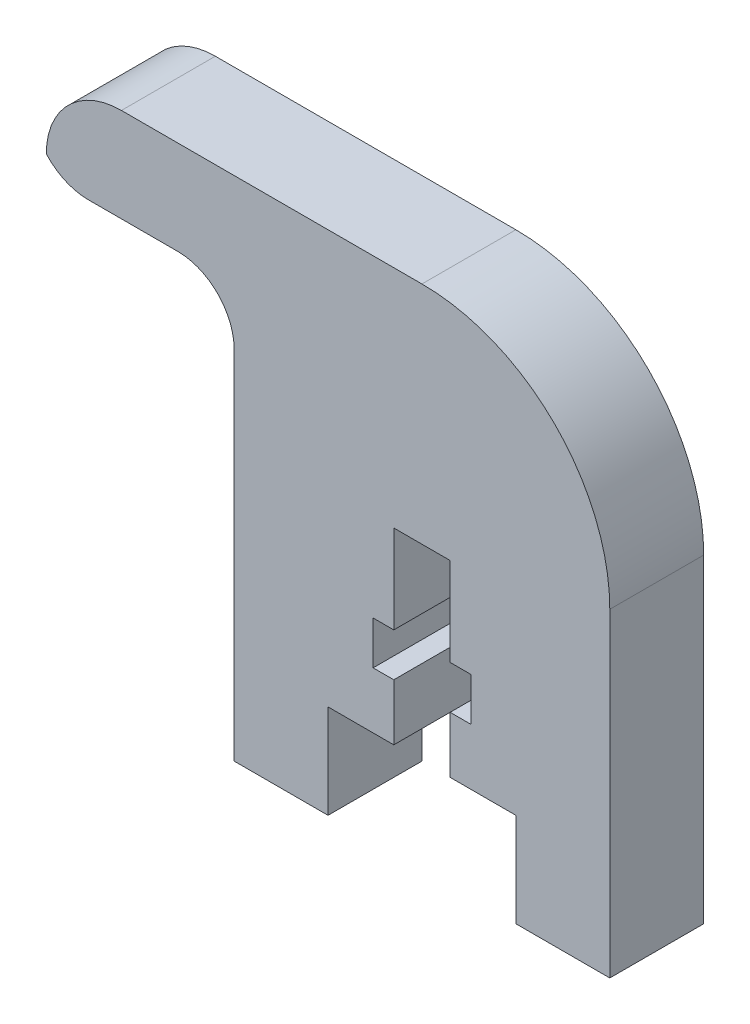
ISO-10303-21;
HEADER;
FILE_DESCRIPTION(('STEP AP214'),'2;1');
FILE_NAME('part.step','',(''),(''),'','','');
FILE_SCHEMA(('AUTOMOTIVE_DESIGN { 1 0 10303 214 1 1 1 1 }'));
ENDSEC;
DATA;
#1=APPLICATION_CONTEXT('core data for automotive mechanical design processes');
#2=APPLICATION_PROTOCOL_DEFINITION('international standard','automotive_design',2000,#1);
#3=PRODUCT_CONTEXT('',#1,'mechanical');
#4=PRODUCT('Part','Part','',(#3));
#5=PRODUCT_RELATED_PRODUCT_CATEGORY('part','',(#4));
#6=PRODUCT_DEFINITION_FORMATION('','',#4);
#7=PRODUCT_DEFINITION_CONTEXT('part definition',#1,'design');
#8=PRODUCT_DEFINITION('design','',#6,#7);
#9=PRODUCT_DEFINITION_SHAPE('','',#8);
#10=(LENGTH_UNIT() NAMED_UNIT(*) SI_UNIT(.MILLI.,.METRE.));
#11=(NAMED_UNIT(*) PLANE_ANGLE_UNIT() SI_UNIT($,.RADIAN.));
#12=(NAMED_UNIT(*) SI_UNIT($,.STERADIAN.) SOLID_ANGLE_UNIT());
#13=UNCERTAINTY_MEASURE_WITH_UNIT(LENGTH_MEASURE(1.E-05),#10,'distance_accuracy_value','');
#14=(GEOMETRIC_REPRESENTATION_CONTEXT(3) GLOBAL_UNCERTAINTY_ASSIGNED_CONTEXT((#13)) GLOBAL_UNIT_ASSIGNED_CONTEXT((#10,
#11,#12)) REPRESENTATION_CONTEXT('',''));
#15=CARTESIAN_POINT('',(0.,0.,0.));
#16=DIRECTION('',(0.,0.,1.));
#17=DIRECTION('',(1.,0.,0.));
#18=AXIS2_PLACEMENT_3D('',#15,#16,#17);
#19=CARTESIAN_POINT('',(-24.9425171950352,8.,5.));
#20=DIRECTION('',(-1.,0.,0.));
#21=DIRECTION('',(0.,0.,1.));
#22=AXIS2_PLACEMENT_3D('',#19,#20,#21);
#23=PLANE('',#22);
#24=DIRECTION('',(0.,1.,0.));
#25=VECTOR('',#24,1.);
#26=CARTESIAN_POINT('',(-24.9425171950352,8.,0.));
#27=LINE('',#26,#25);
#28=CARTESIAN_POINT('',(-24.9425171950352,5.,0.));
#29=VERTEX_POINT('',#28);
#30=CARTESIAN_POINT('',(-24.9425171950352,8.,0.));
#31=VERTEX_POINT('',#30);
#32=EDGE_CURVE('E222',#29,#31,#27,.T.);
#33=ORIENTED_EDGE('',*,*,#32,.T.);
#34=DIRECTION('',(0.,0.,-1.));
#35=VECTOR('',#34,1.);
#36=CARTESIAN_POINT('',(-24.9425171950352,8.,5.));
#37=LINE('',#36,#35);
#38=CARTESIAN_POINT('',(-24.9425171950352,8.,5.));
#39=VERTEX_POINT('',#38);
#40=EDGE_CURVE('E204',#39,#31,#37,.T.);
#41=ORIENTED_EDGE('',*,*,#40,.F.);
#42=DIRECTION('',(0.,1.,0.));
#43=VECTOR('',#42,1.);
#44=CARTESIAN_POINT('',(-24.9425171950352,8.,5.));
#45=LINE('',#44,#43);
#46=CARTESIAN_POINT('',(-24.9425171950352,5.,5.));
#47=VERTEX_POINT('',#46);
#48=EDGE_CURVE('E210',#47,#39,#45,.T.);
#49=ORIENTED_EDGE('',*,*,#48,.F.);
#50=DIRECTION('',(0.,0.,-1.));
#51=VECTOR('',#50,1.);
#52=CARTESIAN_POINT('',(-24.9425171950352,5.,5.));
#53=LINE('',#52,#51);
#54=EDGE_CURVE('E289',#47,#29,#53,.T.);
#55=ORIENTED_EDGE('',*,*,#54,.T.);
#56=EDGE_LOOP('',(#33,#41,#49,#55));
#57=FACE_BOUND('',#56,.T.);
#58=ADVANCED_FACE('F33',(#57),#23,.F.);
#59=CARTESIAN_POINT('',(-24.9425171950352,8.,5.));
#60=DIRECTION('',(0.,-1.,0.));
#61=DIRECTION('',(1.,0.,0.));
#62=AXIS2_PLACEMENT_3D('',#59,#60,#61);
#63=PLANE('',#62);
#64=DIRECTION('',(-1.,0.,0.));
#65=VECTOR('',#64,1.);
#66=CARTESIAN_POINT('',(-24.9425171950352,8.,0.));
#67=LINE('',#66,#65);
#68=CARTESIAN_POINT('',(-26.0425171950352,8.00000000000001,0.));
#69=VERTEX_POINT('',#68);
#70=EDGE_CURVE('E291',#31,#69,#67,.T.);
#71=ORIENTED_EDGE('',*,*,#70,.T.);
#72=DIRECTION('',(0.,0.,-1.));
#73=VECTOR('',#72,1.);
#74=CARTESIAN_POINT('',(-26.0425171950352,8.00000000000001,5.));
#75=LINE('',#74,#73);
#76=CARTESIAN_POINT('',(-26.0425171950352,8.00000000000001,5.));
#77=VERTEX_POINT('',#76);
#78=EDGE_CURVE('E207',#77,#69,#75,.T.);
#79=ORIENTED_EDGE('',*,*,#78,.F.);
#80=DIRECTION('',(-1.,0.,0.));
#81=VECTOR('',#80,1.);
#82=CARTESIAN_POINT('',(-24.9425171950352,8.,5.));
#83=LINE('',#82,#81);
#84=EDGE_CURVE('E200',#39,#77,#83,.T.);
#85=ORIENTED_EDGE('',*,*,#84,.F.);
#86=ORIENTED_EDGE('',*,*,#40,.T.);
#87=EDGE_LOOP('',(#71,#79,#85,#86));
#88=FACE_BOUND('',#87,.T.);
#89=ADVANCED_FACE('F202',(#88),#63,.F.);
#90=CARTESIAN_POINT('',(-26.0425171950352,8.00000000000001,5.));
#91=DIRECTION('',(-1.,0.,0.));
#92=DIRECTION('',(0.,0.,1.));
#93=AXIS2_PLACEMENT_3D('',#90,#91,#92);
#94=PLANE('',#93);
#95=DIRECTION('',(0.,1.,0.));
#96=VECTOR('',#95,1.);
#97=CARTESIAN_POINT('',(-26.0425171950352,8.00000000000001,0.));
#98=LINE('',#97,#96);
#99=CARTESIAN_POINT('',(-26.0425171950352,10.3,0.));
#100=VERTEX_POINT('',#99);
#101=EDGE_CURVE('E293',#69,#100,#98,.T.);
#102=ORIENTED_EDGE('',*,*,#101,.T.);
#103=DIRECTION('',(0.,0.,-1.));
#104=VECTOR('',#103,1.);
#105=CARTESIAN_POINT('',(-26.0425171950352,10.3,5.));
#106=LINE('',#105,#104);
#107=CARTESIAN_POINT('',(-26.0425171950352,10.3,5.));
#108=VERTEX_POINT('',#107);
#109=EDGE_CURVE('E228',#108,#100,#106,.T.);
#110=ORIENTED_EDGE('',*,*,#109,.F.);
#111=DIRECTION('',(0.,1.,0.));
#112=VECTOR('',#111,1.);
#113=CARTESIAN_POINT('',(-26.0425171950352,8.00000000000001,5.));
#114=LINE('',#113,#112);
#115=EDGE_CURVE('E209',#77,#108,#114,.T.);
#116=ORIENTED_EDGE('',*,*,#115,.F.);
#117=ORIENTED_EDGE('',*,*,#78,.T.);
#118=EDGE_LOOP('',(#102,#110,#116,#117));
#119=FACE_BOUND('',#118,.T.);
#120=ADVANCED_FACE('F486',(#119),#94,.F.);
#121=CARTESIAN_POINT('',(-26.0425171950352,10.3,5.));
#122=DIRECTION('',(0.,1.,0.));
#123=DIRECTION('',(-1.,0.,0.));
#124=AXIS2_PLACEMENT_3D('',#121,#122,#123);
#125=PLANE('',#124);
#126=DIRECTION('',(1.,0.,0.));
#127=VECTOR('',#126,1.);
#128=CARTESIAN_POINT('',(-26.0425171950352,10.3,0.));
#129=LINE('',#128,#127);
#130=CARTESIAN_POINT('',(-24.9425171950352,10.3,0.));
#131=VERTEX_POINT('',#130);
#132=EDGE_CURVE('E295',#100,#131,#129,.T.);
#133=ORIENTED_EDGE('',*,*,#132,.T.);
#134=DIRECTION('',(0.,0.,-1.));
#135=VECTOR('',#134,1.);
#136=CARTESIAN_POINT('',(-24.9425171950352,10.3,5.));
#137=LINE('',#136,#135);
#138=CARTESIAN_POINT('',(-24.9425171950352,10.3,5.));
#139=VERTEX_POINT('',#138);
#140=EDGE_CURVE('E367',#139,#131,#137,.T.);
#141=ORIENTED_EDGE('',*,*,#140,.F.);
#142=DIRECTION('',(1.,0.,0.));
#143=VECTOR('',#142,1.);
#144=CARTESIAN_POINT('',(-26.0425171950352,10.3,5.));
#145=LINE('',#144,#143);
#146=EDGE_CURVE('E376',#108,#139,#145,.T.);
#147=ORIENTED_EDGE('',*,*,#146,.F.);
#148=ORIENTED_EDGE('',*,*,#109,.T.);
#149=EDGE_LOOP('',(#133,#141,#147,#148));
#150=FACE_BOUND('',#149,.T.);
#151=ADVANCED_FACE('F374',(#150),#125,.F.);
#152=CARTESIAN_POINT('',(-24.9425171950352,15.,5.));
#153=DIRECTION('',(-1.,0.,0.));
#154=DIRECTION('',(0.,0.,1.));
#155=AXIS2_PLACEMENT_3D('',#152,#153,#154);
#156=PLANE('',#155);
#157=DIRECTION('',(0.,1.,0.));
#158=VECTOR('',#157,1.);
#159=CARTESIAN_POINT('',(-24.9425171950352,15.,0.));
#160=LINE('',#159,#158);
#161=CARTESIAN_POINT('',(-24.9425171950352,15.,0.));
#162=VERTEX_POINT('',#161);
#163=EDGE_CURVE('E297',#131,#162,#160,.T.);
#164=ORIENTED_EDGE('',*,*,#163,.T.);
#165=DIRECTION('',(0.,0.,-1.));
#166=VECTOR('',#165,1.);
#167=CARTESIAN_POINT('',(-24.9425171950352,15.,5.));
#168=LINE('',#167,#166);
#169=CARTESIAN_POINT('',(-24.9425171950352,15.,5.));
#170=VERTEX_POINT('',#169);
#171=EDGE_CURVE('E364',#170,#162,#168,.T.);
#172=ORIENTED_EDGE('',*,*,#171,.F.);
#173=DIRECTION('',(0.,1.,0.));
#174=VECTOR('',#173,1.);
#175=CARTESIAN_POINT('',(-24.9425171950352,15.,5.));
#176=LINE('',#175,#174);
#177=EDGE_CURVE('E393',#139,#170,#176,.T.);
#178=ORIENTED_EDGE('',*,*,#177,.F.);
#179=ORIENTED_EDGE('',*,*,#140,.T.);
#180=EDGE_LOOP('',(#164,#172,#178,#179));
#181=FACE_BOUND('',#180,.T.);
#182=ADVANCED_FACE('F384',(#181),#156,.F.);
#183=CARTESIAN_POINT('',(-21.9425171950352,15.,5.));
#184=DIRECTION('',(0.,1.,0.));
#185=DIRECTION('',(0.,0.,1.));
#186=AXIS2_PLACEMENT_3D('',#183,#184,#185);
#187=PLANE('',#186);
#188=DIRECTION('',(1.,0.,0.));
#189=VECTOR('',#188,1.);
#190=CARTESIAN_POINT('',(-21.9425171950352,15.,0.));
#191=LINE('',#190,#189);
#192=CARTESIAN_POINT('',(-21.9425171950352,15.,0.));
#193=VERTEX_POINT('',#192);
#194=EDGE_CURVE('E299',#162,#193,#191,.T.);
#195=ORIENTED_EDGE('',*,*,#194,.T.);
#196=DIRECTION('',(0.,0.,-1.));
#197=VECTOR('',#196,1.);
#198=CARTESIAN_POINT('',(-21.9425171950352,15.,5.));
#199=LINE('',#198,#197);
#200=CARTESIAN_POINT('',(-21.9425171950352,15.,5.));
#201=VERTEX_POINT('',#200);
#202=EDGE_CURVE('E361',#201,#193,#199,.T.);
#203=ORIENTED_EDGE('',*,*,#202,.F.);
#204=DIRECTION('',(1.,0.,0.));
#205=VECTOR('',#204,1.);
#206=CARTESIAN_POINT('',(-21.9425171950352,15.,5.));
#207=LINE('',#206,#205);
#208=EDGE_CURVE('E390',#170,#201,#207,.T.);
#209=ORIENTED_EDGE('',*,*,#208,.F.);
#210=ORIENTED_EDGE('',*,*,#171,.T.);
#211=EDGE_LOOP('',(#195,#203,#209,#210));
#212=FACE_BOUND('',#211,.T.);
#213=ADVANCED_FACE('F388',(#212),#187,.F.);
#214=CARTESIAN_POINT('',(-21.9425171950352,10.3,5.));
#215=DIRECTION('',(1.,0.,0.));
#216=DIRECTION('',(0.,1.,0.));
#217=AXIS2_PLACEMENT_3D('',#214,#215,#216);
#218=PLANE('',#217);
#219=DIRECTION('',(0.,-1.,0.));
#220=VECTOR('',#219,1.);
#221=CARTESIAN_POINT('',(-21.9425171950352,10.3,0.));
#222=LINE('',#221,#220);
#223=CARTESIAN_POINT('',(-21.9425171950352,10.3,0.));
#224=VERTEX_POINT('',#223);
#225=EDGE_CURVE('E301',#193,#224,#222,.T.);
#226=ORIENTED_EDGE('',*,*,#225,.T.);
#227=DIRECTION('',(0.,0.,-1.));
#228=VECTOR('',#227,1.);
#229=CARTESIAN_POINT('',(-21.9425171950352,10.3,5.));
#230=LINE('',#229,#228);
#231=CARTESIAN_POINT('',(-21.9425171950352,10.3,5.));
#232=VERTEX_POINT('',#231);
#233=EDGE_CURVE('E358',#232,#224,#230,.T.);
#234=ORIENTED_EDGE('',*,*,#233,.F.);
#235=DIRECTION('',(0.,-1.,0.));
#236=VECTOR('',#235,1.);
#237=CARTESIAN_POINT('',(-21.9425171950352,10.3,5.));
#238=LINE('',#237,#236);
#239=EDGE_CURVE('E392',#201,#232,#238,.T.);
#240=ORIENTED_EDGE('',*,*,#239,.F.);
#241=ORIENTED_EDGE('',*,*,#202,.T.);
#242=EDGE_LOOP('',(#226,#234,#240,#241));
#243=FACE_BOUND('',#242,.T.);
#244=ADVANCED_FACE('F472',(#243),#218,.F.);
#245=CARTESIAN_POINT('',(-21.9425171950352,10.3,5.));
#246=DIRECTION('',(0.,1.,0.));
#247=DIRECTION('',(-1.,0.,0.));
#248=AXIS2_PLACEMENT_3D('',#245,#246,#247);
#249=PLANE('',#248);
#250=DIRECTION('',(1.,0.,0.));
#251=VECTOR('',#250,1.);
#252=CARTESIAN_POINT('',(-21.9425171950352,10.3,0.));
#253=LINE('',#252,#251);
#254=CARTESIAN_POINT('',(-20.8425171950352,10.3,0.));
#255=VERTEX_POINT('',#254);
#256=EDGE_CURVE('E303',#224,#255,#253,.T.);
#257=ORIENTED_EDGE('',*,*,#256,.T.);
#258=DIRECTION('',(0.,0.,-1.));
#259=VECTOR('',#258,1.);
#260=CARTESIAN_POINT('',(-20.8425171950352,10.3,5.));
#261=LINE('',#260,#259);
#262=CARTESIAN_POINT('',(-20.8425171950352,10.3,5.));
#263=VERTEX_POINT('',#262);
#264=EDGE_CURVE('E355',#263,#255,#261,.T.);
#265=ORIENTED_EDGE('',*,*,#264,.F.);
#266=DIRECTION('',(1.,0.,0.));
#267=VECTOR('',#266,1.);
#268=CARTESIAN_POINT('',(-21.9425171950352,10.3,5.));
#269=LINE('',#268,#267);
#270=EDGE_CURVE('E395',#232,#263,#269,.T.);
#271=ORIENTED_EDGE('',*,*,#270,.F.);
#272=ORIENTED_EDGE('',*,*,#233,.T.);
#273=EDGE_LOOP('',(#257,#265,#271,#272));
#274=FACE_BOUND('',#273,.T.);
#275=ADVANCED_FACE('F469',(#274),#249,.F.);
#276=CARTESIAN_POINT('',(-20.8425171950352,10.3,5.));
#277=DIRECTION('',(1.,0.,0.));
#278=DIRECTION('',(0.,1.,0.));
#279=AXIS2_PLACEMENT_3D('',#276,#277,#278);
#280=PLANE('',#279);
#281=DIRECTION('',(0.,-1.,0.));
#282=VECTOR('',#281,1.);
#283=CARTESIAN_POINT('',(-20.8425171950352,10.3,0.));
#284=LINE('',#283,#282);
#285=CARTESIAN_POINT('',(-20.8425171950352,8.,0.));
#286=VERTEX_POINT('',#285);
#287=EDGE_CURVE('E305',#255,#286,#284,.T.);
#288=ORIENTED_EDGE('',*,*,#287,.T.);
#289=DIRECTION('',(0.,0.,-1.));
#290=VECTOR('',#289,1.);
#291=CARTESIAN_POINT('',(-20.8425171950352,8.,5.));
#292=LINE('',#291,#290);
#293=CARTESIAN_POINT('',(-20.8425171950352,8.,5.));
#294=VERTEX_POINT('',#293);
#295=EDGE_CURVE('E352',#294,#286,#292,.T.);
#296=ORIENTED_EDGE('',*,*,#295,.F.);
#297=DIRECTION('',(0.,-1.,0.));
#298=VECTOR('',#297,1.);
#299=CARTESIAN_POINT('',(-20.8425171950352,10.3,5.));
#300=LINE('',#299,#298);
#301=EDGE_CURVE('E401',#263,#294,#300,.T.);
#302=ORIENTED_EDGE('',*,*,#301,.F.);
#303=ORIENTED_EDGE('',*,*,#264,.T.);
#304=EDGE_LOOP('',(#288,#296,#302,#303));
#305=FACE_BOUND('',#304,.T.);
#306=ADVANCED_FACE('F465',(#305),#280,.F.);
#307=CARTESIAN_POINT('',(-20.8425171950352,8.,5.));
#308=DIRECTION('',(0.,-1.,0.));
#309=DIRECTION('',(0.,0.,-1.));
#310=AXIS2_PLACEMENT_3D('',#307,#308,#309);
#311=PLANE('',#310);
#312=DIRECTION('',(-1.,0.,0.));
#313=VECTOR('',#312,1.);
#314=CARTESIAN_POINT('',(-20.8425171950352,8.,0.));
#315=LINE('',#314,#313);
#316=CARTESIAN_POINT('',(-21.9425171950352,8.,0.));
#317=VERTEX_POINT('',#316);
#318=EDGE_CURVE('E307',#286,#317,#315,.T.);
#319=ORIENTED_EDGE('',*,*,#318,.T.);
#320=DIRECTION('',(0.,0.,-1.));
#321=VECTOR('',#320,1.);
#322=CARTESIAN_POINT('',(-21.9425171950352,8.,5.));
#323=LINE('',#322,#321);
#324=CARTESIAN_POINT('',(-21.9425171950352,8.,5.));
#325=VERTEX_POINT('',#324);
#326=EDGE_CURVE('E349',#325,#317,#323,.T.);
#327=ORIENTED_EDGE('',*,*,#326,.F.);
#328=DIRECTION('',(-1.,0.,0.));
#329=VECTOR('',#328,1.);
#330=CARTESIAN_POINT('',(-20.8425171950352,8.,5.));
#331=LINE('',#330,#329);
#332=EDGE_CURVE('E403',#294,#325,#331,.T.);
#333=ORIENTED_EDGE('',*,*,#332,.F.);
#334=ORIENTED_EDGE('',*,*,#295,.T.);
#335=EDGE_LOOP('',(#319,#327,#333,#334));
#336=FACE_BOUND('',#335,.T.);
#337=ADVANCED_FACE('F460',(#336),#311,.F.);
#338=CARTESIAN_POINT('',(-21.9425171950352,5.,5.));
#339=DIRECTION('',(1.,0.,0.));
#340=DIRECTION('',(0.,1.,0.));
#341=AXIS2_PLACEMENT_3D('',#338,#339,#340);
#342=PLANE('',#341);
#343=DIRECTION('',(0.,-1.,0.));
#344=VECTOR('',#343,1.);
#345=CARTESIAN_POINT('',(-21.9425171950352,5.,0.));
#346=LINE('',#345,#344);
#347=CARTESIAN_POINT('',(-21.9425171950352,5.,0.));
#348=VERTEX_POINT('',#347);
#349=EDGE_CURVE('E309',#317,#348,#346,.T.);
#350=ORIENTED_EDGE('',*,*,#349,.T.);
#351=DIRECTION('',(0.,0.,-1.));
#352=VECTOR('',#351,1.);
#353=CARTESIAN_POINT('',(-21.9425171950352,5.,5.));
#354=LINE('',#353,#352);
#355=CARTESIAN_POINT('',(-21.9425171950352,5.,5.));
#356=VERTEX_POINT('',#355);
#357=EDGE_CURVE('E346',#356,#348,#354,.T.);
#358=ORIENTED_EDGE('',*,*,#357,.F.);
#359=DIRECTION('',(0.,-1.,0.));
#360=VECTOR('',#359,1.);
#361=CARTESIAN_POINT('',(-21.9425171950352,5.,5.));
#362=LINE('',#361,#360);
#363=EDGE_CURVE('E405',#325,#356,#362,.T.);
#364=ORIENTED_EDGE('',*,*,#363,.F.);
#365=ORIENTED_EDGE('',*,*,#326,.T.);
#366=EDGE_LOOP('',(#350,#358,#364,#365));
#367=FACE_BOUND('',#366,.T.);
#368=ADVANCED_FACE('F454',(#367),#342,.F.);
#369=CARTESIAN_POINT('',(-21.9425171950352,5.,5.));
#370=DIRECTION('',(0.,1.,0.));
#371=DIRECTION('',(0.,0.,1.));
#372=AXIS2_PLACEMENT_3D('',#369,#370,#371);
#373=PLANE('',#372);
#374=DIRECTION('',(1.,0.,0.));
#375=VECTOR('',#374,1.);
#376=CARTESIAN_POINT('',(-21.9425171950352,5.,0.));
#377=LINE('',#376,#375);
#378=CARTESIAN_POINT('',(-18.4425171950352,5.,0.));
#379=VERTEX_POINT('',#378);
#380=EDGE_CURVE('E311',#348,#379,#377,.T.);
#381=ORIENTED_EDGE('',*,*,#380,.T.);
#382=DIRECTION('',(0.,0.,-1.));
#383=VECTOR('',#382,1.);
#384=CARTESIAN_POINT('',(-18.4425171950352,5.,5.));
#385=LINE('',#384,#383);
#386=CARTESIAN_POINT('',(-18.4425171950352,5.,5.));
#387=VERTEX_POINT('',#386);
#388=EDGE_CURVE('E343',#387,#379,#385,.T.);
#389=ORIENTED_EDGE('',*,*,#388,.F.);
#390=DIRECTION('',(1.,0.,0.));
#391=VECTOR('',#390,1.);
#392=CARTESIAN_POINT('',(-21.9425171950352,5.,5.));
#393=LINE('',#392,#391);
#394=EDGE_CURVE('E407',#356,#387,#393,.T.);
#395=ORIENTED_EDGE('',*,*,#394,.F.);
#396=ORIENTED_EDGE('',*,*,#357,.T.);
#397=EDGE_LOOP('',(#381,#389,#395,#396));
#398=FACE_BOUND('',#397,.T.);
#399=ADVANCED_FACE('F450',(#398),#373,.F.);
#400=CARTESIAN_POINT('',(-18.4425171950352,5.,5.));
#401=DIRECTION('',(1.,0.,0.));
#402=DIRECTION('',(0.,0.,-1.));
#403=AXIS2_PLACEMENT_3D('',#400,#401,#402);
#404=PLANE('',#403);
#405=DIRECTION('',(0.,-1.,0.));
#406=VECTOR('',#405,1.);
#407=CARTESIAN_POINT('',(-18.4425171950352,5.,0.));
#408=LINE('',#407,#406);
#409=CARTESIAN_POINT('',(-18.4425171950352,0.,0.));
#410=VERTEX_POINT('',#409);
#411=EDGE_CURVE('E313',#379,#410,#408,.T.);
#412=ORIENTED_EDGE('',*,*,#411,.T.);
#413=DIRECTION('',(0.,0.,-1.));
#414=VECTOR('',#413,1.);
#415=CARTESIAN_POINT('',(-18.4425171950352,0.,5.));
#416=LINE('',#415,#414);
#417=CARTESIAN_POINT('',(-18.4425171950352,0.,5.));
#418=VERTEX_POINT('',#417);
#419=EDGE_CURVE('E340',#418,#410,#416,.T.);
#420=ORIENTED_EDGE('',*,*,#419,.F.);
#421=DIRECTION('',(0.,-1.,0.));
#422=VECTOR('',#421,1.);
#423=CARTESIAN_POINT('',(-18.4425171950352,5.,5.));
#424=LINE('',#423,#422);
#425=EDGE_CURVE('E409',#387,#418,#424,.T.);
#426=ORIENTED_EDGE('',*,*,#425,.F.);
#427=ORIENTED_EDGE('',*,*,#388,.T.);
#428=EDGE_LOOP('',(#412,#420,#426,#427));
#429=FACE_BOUND('',#428,.T.);
#430=ADVANCED_FACE('F445',(#429),#404,.F.);
#431=CARTESIAN_POINT('',(-18.4425171950352,0.,5.));
#432=DIRECTION('',(0.,1.,0.));
#433=DIRECTION('',(0.,0.,1.));
#434=AXIS2_PLACEMENT_3D('',#431,#432,#433);
#435=PLANE('',#434);
#436=DIRECTION('',(1.,0.,0.));
#437=VECTOR('',#436,1.);
#438=CARTESIAN_POINT('',(-18.4425171950352,0.,0.));
#439=LINE('',#438,#437);
#440=CARTESIAN_POINT('',(-13.4425171950352,0.,0.));
#441=VERTEX_POINT('',#440);
#442=EDGE_CURVE('E315',#410,#441,#439,.T.);
#443=ORIENTED_EDGE('',*,*,#442,.T.);
#444=DIRECTION('',(0.,0.,-1.));
#445=VECTOR('',#444,1.);
#446=CARTESIAN_POINT('',(-13.4425171950352,0.,5.));
#447=LINE('',#446,#445);
#448=CARTESIAN_POINT('',(-13.4425171950352,0.,5.));
#449=VERTEX_POINT('',#448);
#450=EDGE_CURVE('E337',#449,#441,#447,.T.);
#451=ORIENTED_EDGE('',*,*,#450,.F.);
#452=DIRECTION('',(1.,0.,0.));
#453=VECTOR('',#452,1.);
#454=CARTESIAN_POINT('',(-18.4425171950352,0.,5.));
#455=LINE('',#454,#453);
#456=EDGE_CURVE('E411',#418,#449,#455,.T.);
#457=ORIENTED_EDGE('',*,*,#456,.F.);
#458=ORIENTED_EDGE('',*,*,#419,.T.);
#459=EDGE_LOOP('',(#443,#451,#457,#458));
#460=FACE_BOUND('',#459,.T.);
#461=ADVANCED_FACE('F439',(#460),#435,.F.);
#462=CARTESIAN_POINT('',(-13.4425171950352,5.,5.));
#463=DIRECTION('',(-1.,0.,0.));
#464=DIRECTION('',(0.,0.,1.));
#465=AXIS2_PLACEMENT_3D('',#462,#463,#464);
#466=PLANE('',#465);
#467=DIRECTION('',(0.,1.,0.));
#468=VECTOR('',#467,1.);
#469=CARTESIAN_POINT('',(-13.4425171950352,5.,0.));
#470=LINE('',#469,#468);
#471=CARTESIAN_POINT('',(-13.4425171950352,17.,0.));
#472=VERTEX_POINT('',#471);
#473=EDGE_CURVE('E318',#441,#472,#470,.T.);
#474=ORIENTED_EDGE('',*,*,#473,.T.);
#475=DIRECTION('',(0.,0.,-1.));
#476=VECTOR('',#475,1.);
#477=CARTESIAN_POINT('',(-13.4425171950352,17.,5.));
#478=LINE('',#477,#476);
#479=CARTESIAN_POINT('',(-13.4425171950352,17.,5.));
#480=VERTEX_POINT('',#479);
#481=EDGE_CURVE('E233',#472,#480,#478,.F.);
#482=ORIENTED_EDGE('',*,*,#481,.T.);
#483=DIRECTION('',(0.,1.,0.));
#484=VECTOR('',#483,1.);
#485=CARTESIAN_POINT('',(-13.4425171950352,0.,5.));
#486=LINE('',#485,#484);
#487=EDGE_CURVE('E413',#449,#480,#486,.T.);
#488=ORIENTED_EDGE('',*,*,#487,.F.);
#489=ORIENTED_EDGE('',*,*,#450,.T.);
#490=EDGE_LOOP('',(#474,#482,#488,#489));
#491=FACE_BOUND('',#490,.T.);
#492=ADVANCED_FACE('F434',(#491),#466,.F.);
#493=CARTESIAN_POINT('',(-13.4425171950352,27.,5.));
#494=DIRECTION('',(0.,-1.,0.));
#495=DIRECTION('',(1.,0.,0.));
#496=AXIS2_PLACEMENT_3D('',#493,#494,#495);
#497=PLANE('',#496);
#498=DIRECTION('',(-1.,0.,0.));
#499=VECTOR('',#498,1.);
#500=CARTESIAN_POINT('',(-13.4425171950352,27.,0.));
#501=LINE('',#500,#499);
#502=CARTESIAN_POINT('',(-23.4425171950352,27.,0.));
#503=VERTEX_POINT('',#502);
#504=CARTESIAN_POINT('',(-39.4425171950352,27.,0.));
#505=VERTEX_POINT('',#504);
#506=EDGE_CURVE('E266',#503,#505,#501,.T.);
#507=ORIENTED_EDGE('',*,*,#506,.T.);
#508=DIRECTION('',(0.,0.,-1.));
#509=VECTOR('',#508,1.);
#510=CARTESIAN_POINT('',(-39.4425171950352,27.,5.));
#511=LINE('',#510,#509);
#512=CARTESIAN_POINT('',(-39.4425171950352,27.,5.));
#513=VERTEX_POINT('',#512);
#514=EDGE_CURVE('E242',#505,#513,#511,.F.);
#515=ORIENTED_EDGE('',*,*,#514,.T.);
#516=DIRECTION('',(-1.,0.,0.));
#517=VECTOR('',#516,1.);
#518=CARTESIAN_POINT('',(-13.4425171950352,27.,5.));
#519=LINE('',#518,#517);
#520=CARTESIAN_POINT('',(-23.4425171950352,27.,5.));
#521=VERTEX_POINT('',#520);
#522=EDGE_CURVE('E283',#521,#513,#519,.T.);
#523=ORIENTED_EDGE('',*,*,#522,.F.);
#524=DIRECTION('',(0.,0.,-1.));
#525=VECTOR('',#524,1.);
#526=CARTESIAN_POINT('',(-23.4425171950352,27.,5.));
#527=LINE('',#526,#525);
#528=EDGE_CURVE('E223',#521,#503,#527,.T.);
#529=ORIENTED_EDGE('',*,*,#528,.T.);
#530=EDGE_LOOP('',(#507,#515,#523,#529));
#531=FACE_BOUND('',#530,.T.);
#532=ADVANCED_FACE('F428',(#531),#497,.F.);
#533=CARTESIAN_POINT('',(-33.4425171950352,22.,5.));
#534=DIRECTION('',(0.,1.,0.));
#535=DIRECTION('',(0.,0.,1.));
#536=AXIS2_PLACEMENT_3D('',#533,#534,#535);
#537=PLANE('',#536);
#538=DIRECTION('',(1.,0.,0.));
#539=VECTOR('',#538,1.);
#540=CARTESIAN_POINT('',(-33.4425171950352,22.,0.));
#541=LINE('',#540,#539);
#542=CARTESIAN_POINT('',(-41.2064492175354,22.,0.));
#543=VERTEX_POINT('',#542);
#544=CARTESIAN_POINT('',(-36.4425171950352,22.,0.));
#545=VERTEX_POINT('',#544);
#546=EDGE_CURVE('E259',#543,#545,#541,.T.);
#547=ORIENTED_EDGE('',*,*,#546,.T.);
#548=DIRECTION('',(0.,0.,-1.));
#549=VECTOR('',#548,1.);
#550=CARTESIAN_POINT('',(-36.4425171950352,22.,5.));
#551=LINE('',#550,#549);
#552=CARTESIAN_POINT('',(-36.4425171950352,22.,5.));
#553=VERTEX_POINT('',#552);
#554=EDGE_CURVE('E48',#545,#553,#551,.F.);
#555=ORIENTED_EDGE('',*,*,#554,.T.);
#556=DIRECTION('',(1.,0.,0.));
#557=VECTOR('',#556,1.);
#558=CARTESIAN_POINT('',(-33.4425171950352,22.,5.));
#559=LINE('',#558,#557);
#560=CARTESIAN_POINT('',(-41.2064492175354,22.,5.));
#561=VERTEX_POINT('',#560);
#562=EDGE_CURVE('E273',#561,#553,#559,.T.);
#563=ORIENTED_EDGE('',*,*,#562,.F.);
#564=DIRECTION('',(0.,0.,-1.));
#565=VECTOR('',#564,1.);
#566=CARTESIAN_POINT('',(-41.2064492175354,22.,5.));
#567=LINE('',#566,#565);
#568=EDGE_CURVE('E249',#561,#543,#567,.T.);
#569=ORIENTED_EDGE('',*,*,#568,.T.);
#570=EDGE_LOOP('',(#547,#555,#563,#569));
#571=FACE_BOUND('',#570,.T.);
#572=ADVANCED_FACE('F264',(#571),#537,.F.);
#573=CARTESIAN_POINT('',(-33.4425171950352,0.,5.));
#574=DIRECTION('',(1.,0.,0.));
#575=DIRECTION('',(0.,0.,-1.));
#576=AXIS2_PLACEMENT_3D('',#573,#574,#575);
#577=PLANE('',#576);
#578=DIRECTION('',(0.,-1.,0.));
#579=VECTOR('',#578,1.);
#580=CARTESIAN_POINT('',(-33.4425171950352,5.,5.));
#581=LINE('',#580,#579);
#582=CARTESIAN_POINT('',(-33.4425171950352,19.,5.));
#583=VERTEX_POINT('',#582);
#584=CARTESIAN_POINT('',(-33.4425171950352,0.,5.));
#585=VERTEX_POINT('',#584);
#586=EDGE_CURVE('E271',#583,#585,#581,.T.);
#587=ORIENTED_EDGE('',*,*,#586,.F.);
#588=DIRECTION('',(0.,0.,-1.));
#589=VECTOR('',#588,1.);
#590=CARTESIAN_POINT('',(-33.4425171950352,19.,0.));
#591=LINE('',#590,#589);
#592=CARTESIAN_POINT('',(-33.4425171950352,19.,0.));
#593=VERTEX_POINT('',#592);
#594=EDGE_CURVE('E246',#583,#593,#591,.T.);
#595=ORIENTED_EDGE('',*,*,#594,.T.);
#596=DIRECTION('',(0.,-1.,0.));
#597=VECTOR('',#596,1.);
#598=CARTESIAN_POINT('',(-33.4425171950352,0.,0.));
#599=LINE('',#598,#597);
#600=CARTESIAN_POINT('',(-33.4425171950352,0.,0.));
#601=VERTEX_POINT('',#600);
#602=EDGE_CURVE('E261',#593,#601,#599,.T.);
#603=ORIENTED_EDGE('',*,*,#602,.T.);
#604=DIRECTION('',(0.,0.,-1.));
#605=VECTOR('',#604,1.);
#606=CARTESIAN_POINT('',(-33.4425171950352,0.,5.));
#607=LINE('',#606,#605);
#608=EDGE_CURVE('E277',#585,#601,#607,.T.);
#609=ORIENTED_EDGE('',*,*,#608,.F.);
#610=EDGE_LOOP('',(#587,#595,#603,#609));
#611=FACE_BOUND('',#610,.T.);
#612=ADVANCED_FACE('F275',(#611),#577,.F.);
#613=CARTESIAN_POINT('',(-28.4425171950352,0.,5.));
#614=DIRECTION('',(0.,1.,0.));
#615=DIRECTION('',(0.,0.,1.));
#616=AXIS2_PLACEMENT_3D('',#613,#614,#615);
#617=PLANE('',#616);
#618=DIRECTION('',(1.,0.,0.));
#619=VECTOR('',#618,1.);
#620=CARTESIAN_POINT('',(-28.4425171950352,0.,0.));
#621=LINE('',#620,#619);
#622=CARTESIAN_POINT('',(-28.4425171950352,0.,0.));
#623=VERTEX_POINT('',#622);
#624=EDGE_CURVE('E324',#601,#623,#621,.T.);
#625=ORIENTED_EDGE('',*,*,#624,.T.);
#626=DIRECTION('',(0.,0.,-1.));
#627=VECTOR('',#626,1.);
#628=CARTESIAN_POINT('',(-28.4425171950352,0.,5.));
#629=LINE('',#628,#627);
#630=CARTESIAN_POINT('',(-28.4425171950352,0.,5.));
#631=VERTEX_POINT('',#630);
#632=EDGE_CURVE('E333',#631,#623,#629,.T.);
#633=ORIENTED_EDGE('',*,*,#632,.F.);
#634=DIRECTION('',(1.,0.,0.));
#635=VECTOR('',#634,1.);
#636=CARTESIAN_POINT('',(-28.4425171950352,0.,5.));
#637=LINE('',#636,#635);
#638=EDGE_CURVE('E279',#585,#631,#637,.T.);
#639=ORIENTED_EDGE('',*,*,#638,.F.);
#640=ORIENTED_EDGE('',*,*,#608,.T.);
#641=EDGE_LOOP('',(#625,#633,#639,#640));
#642=FACE_BOUND('',#641,.T.);
#643=ADVANCED_FACE('F538',(#642),#617,.F.);
#644=CARTESIAN_POINT('',(-28.4425171950352,0.,5.));
#645=DIRECTION('',(-1.,0.,0.));
#646=DIRECTION('',(0.,0.,1.));
#647=AXIS2_PLACEMENT_3D('',#644,#645,#646);
#648=PLANE('',#647);
#649=DIRECTION('',(0.,1.,0.));
#650=VECTOR('',#649,1.);
#651=CARTESIAN_POINT('',(-28.4425171950352,0.,0.));
#652=LINE('',#651,#650);
#653=CARTESIAN_POINT('',(-28.4425171950352,5.,0.));
#654=VERTEX_POINT('',#653);
#655=EDGE_CURVE('E326',#623,#654,#652,.T.);
#656=ORIENTED_EDGE('',*,*,#655,.T.);
#657=DIRECTION('',(0.,0.,-1.));
#658=VECTOR('',#657,1.);
#659=CARTESIAN_POINT('',(-28.4425171950352,5.,5.));
#660=LINE('',#659,#658);
#661=CARTESIAN_POINT('',(-28.4425171950352,5.,5.));
#662=VERTEX_POINT('',#661);
#663=EDGE_CURVE('E330',#662,#654,#660,.T.);
#664=ORIENTED_EDGE('',*,*,#663,.F.);
#665=DIRECTION('',(0.,1.,0.));
#666=VECTOR('',#665,1.);
#667=CARTESIAN_POINT('',(-28.4425171950352,0.,5.));
#668=LINE('',#667,#666);
#669=EDGE_CURVE('E281',#631,#662,#668,.T.);
#670=ORIENTED_EDGE('',*,*,#669,.F.);
#671=ORIENTED_EDGE('',*,*,#632,.T.);
#672=EDGE_LOOP('',(#656,#664,#670,#671));
#673=FACE_BOUND('',#672,.T.);
#674=ADVANCED_FACE('F579',(#673),#648,.F.);
#675=CARTESIAN_POINT('',(-24.9425171950352,5.,5.));
#676=DIRECTION('',(0.,1.,0.));
#677=DIRECTION('',(-1.,0.,0.));
#678=AXIS2_PLACEMENT_3D('',#675,#676,#677);
#679=PLANE('',#678);
#680=DIRECTION('',(1.,0.,0.));
#681=VECTOR('',#680,1.);
#682=CARTESIAN_POINT('',(-24.9425171950352,5.,0.));
#683=LINE('',#682,#681);
#684=EDGE_CURVE('E219',#654,#29,#683,.T.);
#685=ORIENTED_EDGE('',*,*,#684,.T.);
#686=ORIENTED_EDGE('',*,*,#54,.F.);
#687=DIRECTION('',(1.,0.,0.));
#688=VECTOR('',#687,1.);
#689=CARTESIAN_POINT('',(-24.9425171950352,5.,5.));
#690=LINE('',#689,#688);
#691=EDGE_CURVE('E215',#662,#47,#690,.T.);
#692=ORIENTED_EDGE('',*,*,#691,.F.);
#693=ORIENTED_EDGE('',*,*,#663,.T.);
#694=EDGE_LOOP('',(#685,#686,#692,#693));
#695=FACE_BOUND('',#694,.T.);
#696=ADVANCED_FACE('F527',(#695),#679,.F.);
#697=CARTESIAN_POINT('',(0.,0.,5.));
#698=DIRECTION('',(0.,0.,-1.));
#699=DIRECTION('',(-1.,0.,0.));
#700=AXIS2_PLACEMENT_3D('',#697,#698,#699);
#701=PLANE('',#700);
#702=CARTESIAN_POINT('',(-39.4425171950352,23.,5.));
#703=DIRECTION('',(0.,0.,-1.));
#704=DIRECTION('',(-1.,0.,0.));
#705=AXIS2_PLACEMENT_3D('',#702,#703,#704);
#706=CIRCLE('',#705,4.);
#707=CARTESIAN_POINT('',(-43.4425171950352,23.,5.));
#708=VERTEX_POINT('',#707);
#709=EDGE_CURVE('E244',#513,#708,#706,.F.);
#710=ORIENTED_EDGE('',*,*,#709,.T.);
#711=CARTESIAN_POINT('',(-41.2064492175354,25.,5.));
#712=DIRECTION('',(0.,0.,-1.));
#713=DIRECTION('',(-1.,0.,0.));
#714=AXIS2_PLACEMENT_3D('',#711,#712,#713);
#715=CIRCLE('',#714,3.);
#716=EDGE_CURVE('E55',#708,#561,#715,.F.);
#717=ORIENTED_EDGE('',*,*,#716,.T.);
#718=ORIENTED_EDGE('',*,*,#562,.T.);
#719=CARTESIAN_POINT('',(-36.4425171950352,19.,5.));
#720=DIRECTION('',(0.,0.,-1.));
#721=DIRECTION('',(-1.,0.,0.));
#722=AXIS2_PLACEMENT_3D('',#719,#720,#721);
#723=CIRCLE('',#722,3.);
#724=EDGE_CURVE('E11',#553,#583,#723,.T.);
#725=ORIENTED_EDGE('',*,*,#724,.T.);
#726=ORIENTED_EDGE('',*,*,#586,.T.);
#727=ORIENTED_EDGE('',*,*,#638,.T.);
#728=ORIENTED_EDGE('',*,*,#669,.T.);
#729=ORIENTED_EDGE('',*,*,#691,.T.);
#730=ORIENTED_EDGE('',*,*,#48,.T.);
#731=ORIENTED_EDGE('',*,*,#84,.T.);
#732=ORIENTED_EDGE('',*,*,#115,.T.);
#733=ORIENTED_EDGE('',*,*,#146,.T.);
#734=ORIENTED_EDGE('',*,*,#177,.T.);
#735=ORIENTED_EDGE('',*,*,#208,.T.);
#736=ORIENTED_EDGE('',*,*,#239,.T.);
#737=ORIENTED_EDGE('',*,*,#270,.T.);
#738=ORIENTED_EDGE('',*,*,#301,.T.);
#739=ORIENTED_EDGE('',*,*,#332,.T.);
#740=ORIENTED_EDGE('',*,*,#363,.T.);
#741=ORIENTED_EDGE('',*,*,#394,.T.);
#742=ORIENTED_EDGE('',*,*,#425,.T.);
#743=ORIENTED_EDGE('',*,*,#456,.T.);
#744=ORIENTED_EDGE('',*,*,#487,.T.);
#745=CARTESIAN_POINT('',(-23.4425171950352,17.,5.));
#746=DIRECTION('',(0.,0.,-1.));
#747=DIRECTION('',(-1.,0.,0.));
#748=AXIS2_PLACEMENT_3D('',#745,#746,#747);
#749=CIRCLE('',#748,10.);
#750=EDGE_CURVE('E235',#480,#521,#749,.F.);
#751=ORIENTED_EDGE('',*,*,#750,.T.);
#752=ORIENTED_EDGE('',*,*,#522,.T.);
#753=EDGE_LOOP('',(#710,#717,#718,#725,#726,#727,#728,#729,#730,#731,#732,#733,#734,#735,#736,
#737,#738,#739,#740,#741,#742,#743,#744,#751,#752));
#754=FACE_BOUND('',#753,.T.);
#755=ADVANCED_FACE('F213',(#754),#701,.F.);
#756=CARTESIAN_POINT('',(0.,0.,0.));
#757=DIRECTION('',(0.,0.,-1.));
#758=DIRECTION('',(-1.,0.,0.));
#759=AXIS2_PLACEMENT_3D('',#756,#757,#758);
#760=PLANE('',#759);
#761=ORIENTED_EDGE('',*,*,#546,.F.);
#762=CARTESIAN_POINT('',(-41.2064492175354,25.,0.));
#763=DIRECTION('',(0.,0.,-1.));
#764=DIRECTION('',(-1.,0.,0.));
#765=AXIS2_PLACEMENT_3D('',#762,#763,#764);
#766=CIRCLE('',#765,3.);
#767=CARTESIAN_POINT('',(-43.4425171950352,23.,0.));
#768=VERTEX_POINT('',#767);
#769=EDGE_CURVE('E253',#543,#768,#766,.T.);
#770=ORIENTED_EDGE('',*,*,#769,.T.);
#771=CARTESIAN_POINT('',(-39.4425171950352,23.,0.));
#772=DIRECTION('',(0.,0.,-1.));
#773=DIRECTION('',(-1.,0.,0.));
#774=AXIS2_PLACEMENT_3D('',#771,#772,#773);
#775=CIRCLE('',#774,4.);
#776=EDGE_CURVE('E240',#768,#505,#775,.T.);
#777=ORIENTED_EDGE('',*,*,#776,.T.);
#778=ORIENTED_EDGE('',*,*,#506,.F.);
#779=CARTESIAN_POINT('',(-23.4425171950352,17.,0.));
#780=DIRECTION('',(0.,0.,-1.));
#781=DIRECTION('',(-1.,0.,0.));
#782=AXIS2_PLACEMENT_3D('',#779,#780,#781);
#783=CIRCLE('',#782,10.);
#784=EDGE_CURVE('E226',#503,#472,#783,.T.);
#785=ORIENTED_EDGE('',*,*,#784,.T.);
#786=ORIENTED_EDGE('',*,*,#473,.F.);
#787=ORIENTED_EDGE('',*,*,#442,.F.);
#788=ORIENTED_EDGE('',*,*,#411,.F.);
#789=ORIENTED_EDGE('',*,*,#380,.F.);
#790=ORIENTED_EDGE('',*,*,#349,.F.);
#791=ORIENTED_EDGE('',*,*,#318,.F.);
#792=ORIENTED_EDGE('',*,*,#287,.F.);
#793=ORIENTED_EDGE('',*,*,#256,.F.);
#794=ORIENTED_EDGE('',*,*,#225,.F.);
#795=ORIENTED_EDGE('',*,*,#194,.F.);
#796=ORIENTED_EDGE('',*,*,#163,.F.);
#797=ORIENTED_EDGE('',*,*,#132,.F.);
#798=ORIENTED_EDGE('',*,*,#101,.F.);
#799=ORIENTED_EDGE('',*,*,#70,.F.);
#800=ORIENTED_EDGE('',*,*,#32,.F.);
#801=ORIENTED_EDGE('',*,*,#684,.F.);
#802=ORIENTED_EDGE('',*,*,#655,.F.);
#803=ORIENTED_EDGE('',*,*,#624,.F.);
#804=ORIENTED_EDGE('',*,*,#602,.F.);
#805=CARTESIAN_POINT('',(-36.4425171950352,19.,0.));
#806=DIRECTION('',(0.,0.,-1.));
#807=DIRECTION('',(-1.,0.,0.));
#808=AXIS2_PLACEMENT_3D('',#805,#806,#807);
#809=CIRCLE('',#808,3.);
#810=EDGE_CURVE('E41',#593,#545,#809,.F.);
#811=ORIENTED_EDGE('',*,*,#810,.T.);
#812=EDGE_LOOP('',(#761,#770,#777,#778,#785,#786,#787,#788,#789,#790,#791,#792,#793,#794,#795,
#796,#797,#798,#799,#800,#801,#802,#803,#804,#811));
#813=FACE_BOUND('',#812,.T.);
#814=ADVANCED_FACE('F258',(#813),#760,.T.);
#815=CARTESIAN_POINT('',(-23.4425171950352,17.,5.));
#816=DIRECTION('',(0.,0.,-1.));
#817=DIRECTION('',(-1.,0.,0.));
#818=AXIS2_PLACEMENT_3D('',#815,#816,#817);
#819=CYLINDRICAL_SURFACE('',#818,10.);
#820=ORIENTED_EDGE('',*,*,#750,.F.);
#821=ORIENTED_EDGE('',*,*,#481,.F.);
#822=ORIENTED_EDGE('',*,*,#784,.F.);
#823=ORIENTED_EDGE('',*,*,#528,.F.);
#824=EDGE_LOOP('',(#820,#821,#822,#823));
#825=FACE_BOUND('',#824,.T.);
#826=ADVANCED_FACE('F430',(#825),#819,.T.);
#827=CARTESIAN_POINT('',(-39.4425171950352,23.,5.));
#828=DIRECTION('',(0.,0.,-1.));
#829=DIRECTION('',(-1.,0.,0.));
#830=AXIS2_PLACEMENT_3D('',#827,#828,#829);
#831=CYLINDRICAL_SURFACE('',#830,4.);
#832=ORIENTED_EDGE('',*,*,#709,.F.);
#833=ORIENTED_EDGE('',*,*,#514,.F.);
#834=ORIENTED_EDGE('',*,*,#776,.F.);
#835=DIRECTION('',(0.,0.,-1.));
#836=VECTOR('',#835,1.);
#837=CARTESIAN_POINT('',(-43.4425171950352,23.,5.));
#838=LINE('',#837,#836);
#839=EDGE_CURVE('E237',#708,#768,#838,.T.);
#840=ORIENTED_EDGE('',*,*,#839,.F.);
#841=EDGE_LOOP('',(#832,#833,#834,#840));
#842=FACE_BOUND('',#841,.T.);
#843=ADVANCED_FACE('F424',(#842),#831,.T.);
#844=CARTESIAN_POINT('',(-36.4425171950352,19.,5.));
#845=DIRECTION('',(0.,0.,1.));
#846=DIRECTION('',(1.,0.,0.));
#847=AXIS2_PLACEMENT_3D('',#844,#845,#846);
#848=CYLINDRICAL_SURFACE('',#847,3.);
#849=ORIENTED_EDGE('',*,*,#724,.F.);
#850=ORIENTED_EDGE('',*,*,#554,.F.);
#851=ORIENTED_EDGE('',*,*,#810,.F.);
#852=ORIENTED_EDGE('',*,*,#594,.F.);
#853=EDGE_LOOP('',(#849,#850,#851,#852));
#854=FACE_BOUND('',#853,.T.);
#855=ADVANCED_FACE('F269',(#854),#848,.F.);
#856=CARTESIAN_POINT('',(-41.2064492175354,25.,5.));
#857=DIRECTION('',(0.,0.,-1.));
#858=DIRECTION('',(-1.,0.,0.));
#859=AXIS2_PLACEMENT_3D('',#856,#857,#858);
#860=CYLINDRICAL_SURFACE('',#859,3.);
#861=ORIENTED_EDGE('',*,*,#716,.F.);
#862=ORIENTED_EDGE('',*,*,#839,.T.);
#863=ORIENTED_EDGE('',*,*,#769,.F.);
#864=ORIENTED_EDGE('',*,*,#568,.F.);
#865=EDGE_LOOP('',(#861,#862,#863,#864));
#866=FACE_BOUND('',#865,.T.);
#867=ADVANCED_FACE('F35',(#866),#860,.T.);
#868=CLOSED_SHELL('',(#58,#89,#120,#151,#182,#213,#244,#275,#306,#337,#368,#399,#430,#461,#492,
#532,#572,#612,#643,#674,#696,#755,#814,#826,#843,#855,#867));
#869=MANIFOLD_SOLID_BREP('B2',#868);
#870=ADVANCED_BREP_SHAPE_REPRESENTATION('',(#18,#869),#14);
#871=SHAPE_DEFINITION_REPRESENTATION(#9,#870);
ENDSEC;
END-ISO-10303-21;
